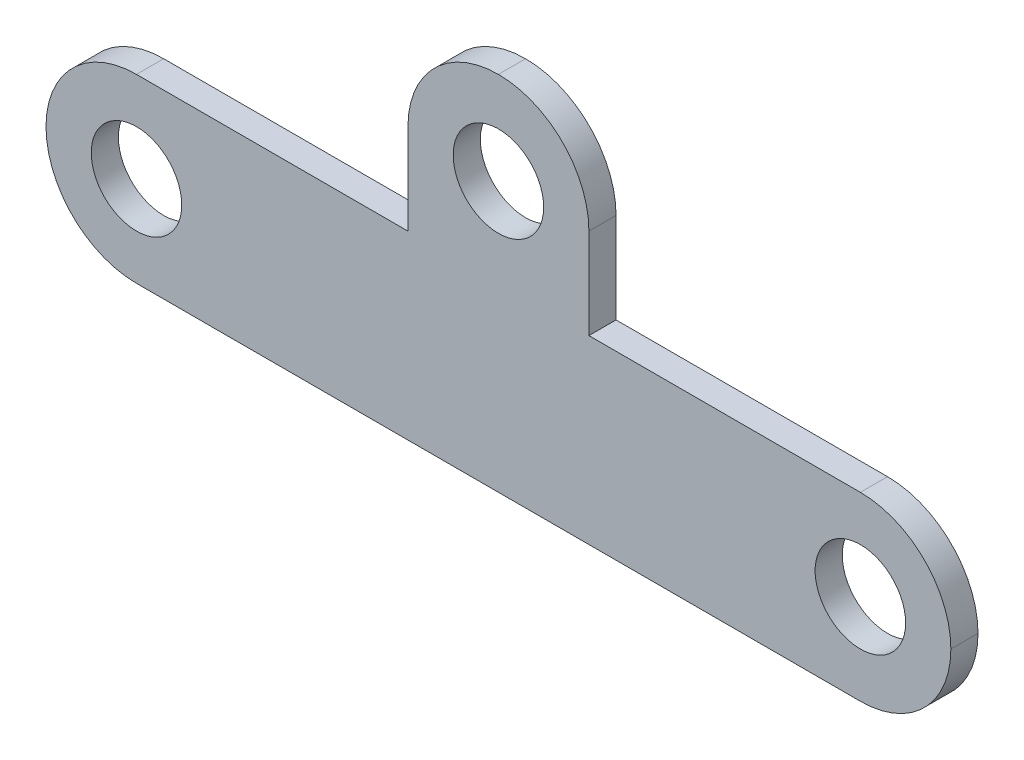
ISO-10303-21;
HEADER;
FILE_DESCRIPTION(('STEP AP214'),'2;1');
FILE_NAME('part.step','',(''),(''),'','','');
FILE_SCHEMA(('AUTOMOTIVE_DESIGN { 1 0 10303 214 1 1 1 1 }'));
ENDSEC;
DATA;
#1=APPLICATION_CONTEXT('core data for automotive mechanical design processes');
#2=APPLICATION_PROTOCOL_DEFINITION('international standard','automotive_design',2000,#1);
#3=PRODUCT_CONTEXT('',#1,'mechanical');
#4=PRODUCT('Part','Part','',(#3));
#5=PRODUCT_RELATED_PRODUCT_CATEGORY('part','',(#4));
#6=PRODUCT_DEFINITION_FORMATION('','',#4);
#7=PRODUCT_DEFINITION_CONTEXT('part definition',#1,'design');
#8=PRODUCT_DEFINITION('design','',#6,#7);
#9=PRODUCT_DEFINITION_SHAPE('','',#8);
#10=(LENGTH_UNIT() NAMED_UNIT(*) SI_UNIT(.MILLI.,.METRE.));
#11=(NAMED_UNIT(*) PLANE_ANGLE_UNIT() SI_UNIT($,.RADIAN.));
#12=(NAMED_UNIT(*) SI_UNIT($,.STERADIAN.) SOLID_ANGLE_UNIT());
#13=UNCERTAINTY_MEASURE_WITH_UNIT(LENGTH_MEASURE(1.E-05),#10,'distance_accuracy_value','');
#14=(GEOMETRIC_REPRESENTATION_CONTEXT(3) GLOBAL_UNCERTAINTY_ASSIGNED_CONTEXT((#13)) GLOBAL_UNIT_ASSIGNED_CONTEXT((#10,
#11,#12)) REPRESENTATION_CONTEXT('',''));
#15=CARTESIAN_POINT('',(0.,0.,0.));
#16=DIRECTION('',(0.,0.,1.));
#17=DIRECTION('',(1.,0.,0.));
#18=AXIS2_PLACEMENT_3D('',#15,#16,#17);
#19=CARTESIAN_POINT('',(0.,20.,3.));
#20=DIRECTION('',(0.,-1.,0.));
#21=DIRECTION('',(0.,0.,-1.));
#22=AXIS2_PLACEMENT_3D('',#19,#20,#21);
#23=PLANE('',#22);
#24=DIRECTION('',(0.,0.,1.));
#25=VECTOR('',#24,1.);
#26=CARTESIAN_POINT('',(40.,20.,3.));
#27=LINE('',#26,#25);
#28=CARTESIAN_POINT('',(40.,20.,0.));
#29=VERTEX_POINT('',#28);
#30=CARTESIAN_POINT('',(40.,20.,3.));
#31=VERTEX_POINT('',#30);
#32=EDGE_CURVE('E119',#29,#31,#27,.T.);
#33=ORIENTED_EDGE('',*,*,#32,.F.);
#34=DIRECTION('',(-1.,0.,0.));
#35=VECTOR('',#34,1.);
#36=CARTESIAN_POINT('',(0.,20.,0.));
#37=LINE('',#36,#35);
#38=CARTESIAN_POINT('',(10.,20.,0.));
#39=VERTEX_POINT('',#38);
#40=EDGE_CURVE('E126',#29,#39,#37,.T.);
#41=ORIENTED_EDGE('',*,*,#40,.T.);
#42=DIRECTION('',(0.,0.,-1.));
#43=VECTOR('',#42,1.);
#44=CARTESIAN_POINT('',(10.,20.,3.));
#45=LINE('',#44,#43);
#46=CARTESIAN_POINT('',(10.,20.,3.));
#47=VERTEX_POINT('',#46);
#48=EDGE_CURVE('E186',#39,#47,#45,.F.);
#49=ORIENTED_EDGE('',*,*,#48,.T.);
#50=DIRECTION('',(-1.,0.,0.));
#51=VECTOR('',#50,1.);
#52=CARTESIAN_POINT('',(0.,20.,3.));
#53=LINE('',#52,#51);
#54=EDGE_CURVE('E137',#31,#47,#53,.T.);
#55=ORIENTED_EDGE('',*,*,#54,.F.);
#56=EDGE_LOOP('',(#33,#41,#49,#55));
#57=FACE_BOUND('',#56,.T.);
#58=ADVANCED_FACE('F33',(#57),#23,.F.);
#59=DIRECTION('',(0.,0.,-1.));
#60=VECTOR('',#59,1.);
#61=CARTESIAN_POINT('',(60.,20.,3.));
#62=LINE('',#61,#60);
#63=CARTESIAN_POINT('',(60.,20.,3.));
#64=VERTEX_POINT('',#63);
#65=CARTESIAN_POINT('',(60.,20.,0.));
#66=VERTEX_POINT('',#65);
#67=EDGE_CURVE('E123',#64,#66,#62,.T.);
#68=ORIENTED_EDGE('',*,*,#67,.F.);
#69=CARTESIAN_POINT('',(90.,20.,3.));
#70=VERTEX_POINT('',#69);
#71=EDGE_CURVE('E158',#70,#64,#53,.T.);
#72=ORIENTED_EDGE('',*,*,#71,.F.);
#73=DIRECTION('',(0.,0.,-1.));
#74=VECTOR('',#73,1.);
#75=CARTESIAN_POINT('',(90.,20.,3.));
#76=LINE('',#75,#74);
#77=CARTESIAN_POINT('',(90.,20.,0.));
#78=VERTEX_POINT('',#77);
#79=EDGE_CURVE('E188',#70,#78,#76,.T.);
#80=ORIENTED_EDGE('',*,*,#79,.T.);
#81=EDGE_CURVE('E133',#78,#66,#37,.T.);
#82=ORIENTED_EDGE('',*,*,#81,.T.);
#83=EDGE_LOOP('',(#68,#72,#80,#82));
#84=FACE_BOUND('',#83,.T.);
#85=ADVANCED_FACE('F247',(#84),#23,.F.);
#86=CARTESIAN_POINT('',(0.,0.,3.));
#87=DIRECTION('',(0.,1.,0.));
#88=DIRECTION('',(0.,0.,1.));
#89=AXIS2_PLACEMENT_3D('',#86,#87,#88);
#90=PLANE('',#89);
#91=DIRECTION('',(1.,0.,0.));
#92=VECTOR('',#91,1.);
#93=CARTESIAN_POINT('',(0.,0.,0.));
#94=LINE('',#93,#92);
#95=CARTESIAN_POINT('',(10.,0.,0.));
#96=VERTEX_POINT('',#95);
#97=CARTESIAN_POINT('',(90.,0.,0.));
#98=VERTEX_POINT('',#97);
#99=EDGE_CURVE('E134',#96,#98,#94,.T.);
#100=ORIENTED_EDGE('',*,*,#99,.T.);
#101=DIRECTION('',(0.,0.,-1.));
#102=VECTOR('',#101,1.);
#103=CARTESIAN_POINT('',(90.,0.,3.));
#104=LINE('',#103,#102);
#105=CARTESIAN_POINT('',(90.,0.,3.));
#106=VERTEX_POINT('',#105);
#107=EDGE_CURVE('E175',#98,#106,#104,.F.);
#108=ORIENTED_EDGE('',*,*,#107,.T.);
#109=DIRECTION('',(1.,0.,0.));
#110=VECTOR('',#109,1.);
#111=CARTESIAN_POINT('',(0.,0.,3.));
#112=LINE('',#111,#110);
#113=CARTESIAN_POINT('',(10.,0.,3.));
#114=VERTEX_POINT('',#113);
#115=EDGE_CURVE('E155',#114,#106,#112,.T.);
#116=ORIENTED_EDGE('',*,*,#115,.F.);
#117=DIRECTION('',(0.,0.,-1.));
#118=VECTOR('',#117,1.);
#119=CARTESIAN_POINT('',(10.,0.,3.));
#120=LINE('',#119,#118);
#121=EDGE_CURVE('E172',#114,#96,#120,.T.);
#122=ORIENTED_EDGE('',*,*,#121,.T.);
#123=EDGE_LOOP('',(#100,#108,#116,#122));
#124=FACE_BOUND('',#123,.T.);
#125=ADVANCED_FACE('F222',(#124),#90,.F.);
#126=CARTESIAN_POINT('',(0.,0.,3.));
#127=DIRECTION('',(0.,0.,-1.));
#128=DIRECTION('',(-1.,0.,0.));
#129=AXIS2_PLACEMENT_3D('',#126,#127,#128);
#130=PLANE('',#129);
#131=CARTESIAN_POINT('',(90.,10.,3.));
#132=DIRECTION('',(0.,0.,1.));
#133=DIRECTION('',(1.,0.,0.));
#134=AXIS2_PLACEMENT_3D('',#131,#132,#133);
#135=CIRCLE('',#134,5.);
#136=CARTESIAN_POINT('',(95.,10.,3.));
#137=VERTEX_POINT('',#136);
#138=EDGE_CURVE('E212',#137,#137,#135,.T.);
#139=ORIENTED_EDGE('',*,*,#138,.F.);
#140=EDGE_LOOP('',(#139));
#141=FACE_BOUND('',#140,.T.);
#142=CARTESIAN_POINT('',(50.,29.7843944745111,3.));
#143=DIRECTION('',(0.,0.,1.));
#144=DIRECTION('',(1.,0.,0.));
#145=AXIS2_PLACEMENT_3D('',#142,#143,#144);
#146=CIRCLE('',#145,5.);
#147=CARTESIAN_POINT('',(55.,29.7843944745111,3.));
#148=VERTEX_POINT('',#147);
#149=EDGE_CURVE('E204',#148,#148,#146,.T.);
#150=ORIENTED_EDGE('',*,*,#149,.F.);
#151=EDGE_LOOP('',(#150));
#152=FACE_BOUND('',#151,.T.);
#153=CARTESIAN_POINT('',(10.,10.,3.));
#154=DIRECTION('',(0.,0.,1.));
#155=DIRECTION('',(1.,0.,0.));
#156=AXIS2_PLACEMENT_3D('',#153,#154,#155);
#157=CIRCLE('',#156,5.);
#158=CARTESIAN_POINT('',(15.,10.,3.));
#159=VERTEX_POINT('',#158);
#160=EDGE_CURVE('E146',#159,#159,#157,.T.);
#161=ORIENTED_EDGE('',*,*,#160,.F.);
#162=EDGE_LOOP('',(#161));
#163=FACE_BOUND('',#162,.T.);
#164=CARTESIAN_POINT('',(50.,30.,3.));
#165=DIRECTION('',(0.,0.,-1.));
#166=DIRECTION('',(-1.,0.,0.));
#167=AXIS2_PLACEMENT_3D('',#164,#165,#166);
#168=CIRCLE('',#167,10.);
#169=CARTESIAN_POINT('',(60.,30.,3.));
#170=VERTEX_POINT('',#169);
#171=CARTESIAN_POINT('',(50.,40.,3.));
#172=VERTEX_POINT('',#171);
#173=EDGE_CURVE('E190',#170,#172,#168,.F.);
#174=ORIENTED_EDGE('',*,*,#173,.T.);
#175=CARTESIAN_POINT('',(50.,30.,3.));
#176=DIRECTION('',(0.,0.,-1.));
#177=DIRECTION('',(-1.,0.,0.));
#178=AXIS2_PLACEMENT_3D('',#175,#176,#177);
#179=CIRCLE('',#178,10.);
#180=CARTESIAN_POINT('',(40.,30.,3.));
#181=VERTEX_POINT('',#180);
#182=EDGE_CURVE('E196',#172,#181,#179,.F.);
#183=ORIENTED_EDGE('',*,*,#182,.T.);
#184=DIRECTION('',(0.,-1.,0.));
#185=VECTOR('',#184,1.);
#186=CARTESIAN_POINT('',(40.,40.,3.));
#187=LINE('',#186,#185);
#188=EDGE_CURVE('E152',#181,#31,#187,.T.);
#189=ORIENTED_EDGE('',*,*,#188,.T.);
#190=ORIENTED_EDGE('',*,*,#54,.T.);
#191=CARTESIAN_POINT('',(10.,10.,3.));
#192=DIRECTION('',(0.,0.,-1.));
#193=DIRECTION('',(-1.,0.,0.));
#194=AXIS2_PLACEMENT_3D('',#191,#192,#193);
#195=CIRCLE('',#194,10.);
#196=CARTESIAN_POINT('',(0.,10.,3.));
#197=VERTEX_POINT('',#196);
#198=EDGE_CURVE('E178',#47,#197,#195,.F.);
#199=ORIENTED_EDGE('',*,*,#198,.T.);
#200=CARTESIAN_POINT('',(10.,10.,3.));
#201=DIRECTION('',(0.,0.,-1.));
#202=DIRECTION('',(-1.,0.,0.));
#203=AXIS2_PLACEMENT_3D('',#200,#201,#202);
#204=CIRCLE('',#203,10.);
#205=EDGE_CURVE('E180',#197,#114,#204,.F.);
#206=ORIENTED_EDGE('',*,*,#205,.T.);
#207=ORIENTED_EDGE('',*,*,#115,.T.);
#208=CARTESIAN_POINT('',(90.,10.,3.));
#209=DIRECTION('',(0.,0.,-1.));
#210=DIRECTION('',(-1.,0.,0.));
#211=AXIS2_PLACEMENT_3D('',#208,#209,#210);
#212=CIRCLE('',#211,10.);
#213=CARTESIAN_POINT('',(100.,10.,3.));
#214=VERTEX_POINT('',#213);
#215=EDGE_CURVE('E184',#106,#214,#212,.F.);
#216=ORIENTED_EDGE('',*,*,#215,.T.);
#217=CARTESIAN_POINT('',(90.,10.,3.));
#218=DIRECTION('',(0.,0.,-1.));
#219=DIRECTION('',(-1.,0.,0.));
#220=AXIS2_PLACEMENT_3D('',#217,#218,#219);
#221=CIRCLE('',#220,10.);
#222=EDGE_CURVE('E182',#214,#70,#221,.F.);
#223=ORIENTED_EDGE('',*,*,#222,.T.);
#224=ORIENTED_EDGE('',*,*,#71,.T.);
#225=DIRECTION('',(0.,-1.,0.));
#226=VECTOR('',#225,1.);
#227=CARTESIAN_POINT('',(60.,40.,3.));
#228=LINE('',#227,#226);
#229=EDGE_CURVE('E150',#170,#64,#228,.T.);
#230=ORIENTED_EDGE('',*,*,#229,.F.);
#231=EDGE_LOOP('',(#174,#183,#189,#190,#199,#206,#207,#216,#223,#224,#230));
#232=FACE_BOUND('',#231,.T.);
#233=ADVANCED_FACE('F219',(#141,#152,#163,#232),#130,.F.);
#234=CARTESIAN_POINT('',(0.,0.,0.));
#235=DIRECTION('',(0.,0.,-1.));
#236=DIRECTION('',(-1.,0.,0.));
#237=AXIS2_PLACEMENT_3D('',#234,#235,#236);
#238=PLANE('',#237);
#239=CARTESIAN_POINT('',(90.,10.,0.));
#240=DIRECTION('',(0.,0.,-1.));
#241=DIRECTION('',(-1.,0.,0.));
#242=AXIS2_PLACEMENT_3D('',#239,#240,#241);
#243=CIRCLE('',#242,5.);
#244=CARTESIAN_POINT('',(85.,10.,0.));
#245=VERTEX_POINT('',#244);
#246=EDGE_CURVE('E37',#245,#245,#243,.T.);
#247=ORIENTED_EDGE('',*,*,#246,.F.);
#248=EDGE_LOOP('',(#247));
#249=FACE_BOUND('',#248,.T.);
#250=CARTESIAN_POINT('',(50.,29.7843944745111,0.));
#251=DIRECTION('',(0.,0.,-1.));
#252=DIRECTION('',(-1.,0.,0.));
#253=AXIS2_PLACEMENT_3D('',#250,#251,#252);
#254=CIRCLE('',#253,5.);
#255=CARTESIAN_POINT('',(45.,29.7843944745111,0.));
#256=VERTEX_POINT('',#255);
#257=EDGE_CURVE('E202',#256,#256,#254,.T.);
#258=ORIENTED_EDGE('',*,*,#257,.F.);
#259=EDGE_LOOP('',(#258));
#260=FACE_BOUND('',#259,.T.);
#261=CARTESIAN_POINT('',(10.,10.,0.));
#262=DIRECTION('',(0.,0.,-1.));
#263=DIRECTION('',(-1.,0.,0.));
#264=AXIS2_PLACEMENT_3D('',#261,#262,#263);
#265=CIRCLE('',#264,5.);
#266=CARTESIAN_POINT('',(5.,10.,0.));
#267=VERTEX_POINT('',#266);
#268=EDGE_CURVE('E143',#267,#267,#265,.T.);
#269=ORIENTED_EDGE('',*,*,#268,.F.);
#270=EDGE_LOOP('',(#269));
#271=FACE_BOUND('',#270,.T.);
#272=DIRECTION('',(0.,-1.,0.));
#273=VECTOR('',#272,1.);
#274=CARTESIAN_POINT('',(40.,40.,0.));
#275=LINE('',#274,#273);
#276=CARTESIAN_POINT('',(40.,30.,0.));
#277=VERTEX_POINT('',#276);
#278=EDGE_CURVE('E114',#277,#29,#275,.T.);
#279=ORIENTED_EDGE('',*,*,#278,.F.);
#280=CARTESIAN_POINT('',(50.,30.,0.));
#281=DIRECTION('',(0.,0.,-1.));
#282=DIRECTION('',(-1.,0.,0.));
#283=AXIS2_PLACEMENT_3D('',#280,#281,#282);
#284=CIRCLE('',#283,10.);
#285=CARTESIAN_POINT('',(50.,40.,0.));
#286=VERTEX_POINT('',#285);
#287=EDGE_CURVE('E42',#277,#286,#284,.T.);
#288=ORIENTED_EDGE('',*,*,#287,.T.);
#289=CARTESIAN_POINT('',(50.,30.,0.));
#290=DIRECTION('',(0.,0.,-1.));
#291=DIRECTION('',(-1.,0.,0.));
#292=AXIS2_PLACEMENT_3D('',#289,#290,#291);
#293=CIRCLE('',#292,10.);
#294=CARTESIAN_POINT('',(60.,30.,0.));
#295=VERTEX_POINT('',#294);
#296=EDGE_CURVE('E50',#286,#295,#293,.T.);
#297=ORIENTED_EDGE('',*,*,#296,.T.);
#298=DIRECTION('',(0.,-1.,0.));
#299=VECTOR('',#298,1.);
#300=CARTESIAN_POINT('',(60.,40.,0.));
#301=LINE('',#300,#299);
#302=EDGE_CURVE('E122',#295,#66,#301,.T.);
#303=ORIENTED_EDGE('',*,*,#302,.T.);
#304=ORIENTED_EDGE('',*,*,#81,.F.);
#305=CARTESIAN_POINT('',(90.,10.,0.));
#306=DIRECTION('',(0.,0.,-1.));
#307=DIRECTION('',(-1.,0.,0.));
#308=AXIS2_PLACEMENT_3D('',#305,#306,#307);
#309=CIRCLE('',#308,10.);
#310=CARTESIAN_POINT('',(100.,10.,0.));
#311=VERTEX_POINT('',#310);
#312=EDGE_CURVE('E168',#78,#311,#309,.T.);
#313=ORIENTED_EDGE('',*,*,#312,.T.);
#314=CARTESIAN_POINT('',(90.,10.,0.));
#315=DIRECTION('',(0.,0.,-1.));
#316=DIRECTION('',(-1.,0.,0.));
#317=AXIS2_PLACEMENT_3D('',#314,#315,#316);
#318=CIRCLE('',#317,10.);
#319=EDGE_CURVE('E170',#311,#98,#318,.T.);
#320=ORIENTED_EDGE('',*,*,#319,.T.);
#321=ORIENTED_EDGE('',*,*,#99,.F.);
#322=CARTESIAN_POINT('',(10.,10.,0.));
#323=DIRECTION('',(0.,0.,-1.));
#324=DIRECTION('',(-1.,0.,0.));
#325=AXIS2_PLACEMENT_3D('',#322,#323,#324);
#326=CIRCLE('',#325,10.);
#327=CARTESIAN_POINT('',(0.,10.,0.));
#328=VERTEX_POINT('',#327);
#329=EDGE_CURVE('E166',#96,#328,#326,.T.);
#330=ORIENTED_EDGE('',*,*,#329,.T.);
#331=CARTESIAN_POINT('',(10.,10.,0.));
#332=DIRECTION('',(0.,0.,-1.));
#333=DIRECTION('',(-1.,0.,0.));
#334=AXIS2_PLACEMENT_3D('',#331,#332,#333);
#335=CIRCLE('',#334,10.);
#336=EDGE_CURVE('E129',#328,#39,#335,.T.);
#337=ORIENTED_EDGE('',*,*,#336,.T.);
#338=ORIENTED_EDGE('',*,*,#40,.F.);
#339=EDGE_LOOP('',(#279,#288,#297,#303,#304,#313,#320,#321,#330,#337,#338));
#340=FACE_BOUND('',#339,.T.);
#341=ADVANCED_FACE('F127',(#249,#260,#271,#340),#238,.T.);
#342=CARTESIAN_POINT('',(90.,10.,3.));
#343=DIRECTION('',(0.,0.,-1.));
#344=DIRECTION('',(-1.,0.,0.));
#345=AXIS2_PLACEMENT_3D('',#342,#343,#344);
#346=CYLINDRICAL_SURFACE('',#345,10.);
#347=ORIENTED_EDGE('',*,*,#79,.F.);
#348=ORIENTED_EDGE('',*,*,#222,.F.);
#349=DIRECTION('',(0.,0.,-1.));
#350=VECTOR('',#349,1.);
#351=CARTESIAN_POINT('',(100.,10.,3.));
#352=LINE('',#351,#350);
#353=EDGE_CURVE('E162',#311,#214,#352,.F.);
#354=ORIENTED_EDGE('',*,*,#353,.F.);
#355=ORIENTED_EDGE('',*,*,#312,.F.);
#356=EDGE_LOOP('',(#347,#348,#354,#355));
#357=FACE_BOUND('',#356,.T.);
#358=ADVANCED_FACE('F262',(#357),#346,.T.);
#359=CARTESIAN_POINT('',(90.,10.,3.));
#360=DIRECTION('',(0.,0.,-1.));
#361=DIRECTION('',(-1.,0.,0.));
#362=AXIS2_PLACEMENT_3D('',#359,#360,#361);
#363=CYLINDRICAL_SURFACE('',#362,10.);
#364=ORIENTED_EDGE('',*,*,#215,.F.);
#365=ORIENTED_EDGE('',*,*,#107,.F.);
#366=ORIENTED_EDGE('',*,*,#319,.F.);
#367=ORIENTED_EDGE('',*,*,#353,.T.);
#368=EDGE_LOOP('',(#364,#365,#366,#367));
#369=FACE_BOUND('',#368,.T.);
#370=ADVANCED_FACE('F258',(#369),#363,.T.);
#371=CARTESIAN_POINT('',(10.,10.,3.));
#372=DIRECTION('',(0.,0.,-1.));
#373=DIRECTION('',(-1.,0.,0.));
#374=AXIS2_PLACEMENT_3D('',#371,#372,#373);
#375=CYLINDRICAL_SURFACE('',#374,10.);
#376=DIRECTION('',(0.,0.,-1.));
#377=VECTOR('',#376,1.);
#378=CARTESIAN_POINT('',(0.,10.,3.));
#379=LINE('',#378,#377);
#380=EDGE_CURVE('E154',#197,#328,#379,.T.);
#381=ORIENTED_EDGE('',*,*,#380,.F.);
#382=ORIENTED_EDGE('',*,*,#198,.F.);
#383=ORIENTED_EDGE('',*,*,#48,.F.);
#384=ORIENTED_EDGE('',*,*,#336,.F.);
#385=EDGE_LOOP('',(#381,#382,#383,#384));
#386=FACE_BOUND('',#385,.T.);
#387=ADVANCED_FACE('F261',(#386),#375,.T.);
#388=CARTESIAN_POINT('',(10.,10.,3.));
#389=DIRECTION('',(0.,0.,-1.));
#390=DIRECTION('',(-1.,0.,0.));
#391=AXIS2_PLACEMENT_3D('',#388,#389,#390);
#392=CYLINDRICAL_SURFACE('',#391,10.);
#393=ORIENTED_EDGE('',*,*,#205,.F.);
#394=ORIENTED_EDGE('',*,*,#380,.T.);
#395=ORIENTED_EDGE('',*,*,#329,.F.);
#396=ORIENTED_EDGE('',*,*,#121,.F.);
#397=EDGE_LOOP('',(#393,#394,#395,#396));
#398=FACE_BOUND('',#397,.T.);
#399=ADVANCED_FACE('F267',(#398),#392,.T.);
#400=CARTESIAN_POINT('',(40.,40.,3.));
#401=DIRECTION('',(1.,0.,0.));
#402=DIRECTION('',(0.,0.,-1.));
#403=AXIS2_PLACEMENT_3D('',#400,#401,#402);
#404=PLANE('',#403);
#405=ORIENTED_EDGE('',*,*,#188,.F.);
#406=DIRECTION('',(0.,0.,1.));
#407=VECTOR('',#406,1.);
#408=CARTESIAN_POINT('',(40.,30.,3.));
#409=LINE('',#408,#407);
#410=EDGE_CURVE('E121',#181,#277,#409,.F.);
#411=ORIENTED_EDGE('',*,*,#410,.T.);
#412=ORIENTED_EDGE('',*,*,#278,.T.);
#413=ORIENTED_EDGE('',*,*,#32,.T.);
#414=EDGE_LOOP('',(#405,#411,#412,#413));
#415=FACE_BOUND('',#414,.T.);
#416=ADVANCED_FACE('F117',(#415),#404,.F.);
#417=CARTESIAN_POINT('',(60.,40.,3.));
#418=DIRECTION('',(-1.,0.,0.));
#419=DIRECTION('',(0.,0.,1.));
#420=AXIS2_PLACEMENT_3D('',#417,#418,#419);
#421=PLANE('',#420);
#422=ORIENTED_EDGE('',*,*,#302,.F.);
#423=DIRECTION('',(0.,0.,-1.));
#424=VECTOR('',#423,1.);
#425=CARTESIAN_POINT('',(60.,30.,3.));
#426=LINE('',#425,#424);
#427=EDGE_CURVE('E11',#295,#170,#426,.F.);
#428=ORIENTED_EDGE('',*,*,#427,.T.);
#429=ORIENTED_EDGE('',*,*,#229,.T.);
#430=ORIENTED_EDGE('',*,*,#67,.T.);
#431=EDGE_LOOP('',(#422,#428,#429,#430));
#432=FACE_BOUND('',#431,.T.);
#433=ADVANCED_FACE('F244',(#432),#421,.F.);
#434=CARTESIAN_POINT('',(50.,30.,0.));
#435=DIRECTION('',(0.,0.,-1.));
#436=DIRECTION('',(-1.,0.,0.));
#437=AXIS2_PLACEMENT_3D('',#434,#435,#436);
#438=CYLINDRICAL_SURFACE('',#437,10.);
#439=ORIENTED_EDGE('',*,*,#427,.F.);
#440=ORIENTED_EDGE('',*,*,#296,.F.);
#441=DIRECTION('',(0.,0.,-1.));
#442=VECTOR('',#441,1.);
#443=CARTESIAN_POINT('',(50.,40.,0.));
#444=LINE('',#443,#442);
#445=EDGE_CURVE('E138',#172,#286,#444,.T.);
#446=ORIENTED_EDGE('',*,*,#445,.F.);
#447=ORIENTED_EDGE('',*,*,#173,.F.);
#448=EDGE_LOOP('',(#439,#440,#446,#447));
#449=FACE_BOUND('',#448,.T.);
#450=ADVANCED_FACE('F35',(#449),#438,.T.);
#451=CARTESIAN_POINT('',(50.,30.,0.));
#452=DIRECTION('',(0.,0.,1.));
#453=DIRECTION('',(1.,0.,0.));
#454=AXIS2_PLACEMENT_3D('',#451,#452,#453);
#455=CYLINDRICAL_SURFACE('',#454,10.);
#456=ORIENTED_EDGE('',*,*,#287,.F.);
#457=ORIENTED_EDGE('',*,*,#410,.F.);
#458=ORIENTED_EDGE('',*,*,#182,.F.);
#459=ORIENTED_EDGE('',*,*,#445,.T.);
#460=EDGE_LOOP('',(#456,#457,#458,#459));
#461=FACE_BOUND('',#460,.T.);
#462=ADVANCED_FACE('F234',(#461),#455,.T.);
#463=CARTESIAN_POINT('',(10.,10.,-7.));
#464=DIRECTION('',(0.,0.,1.));
#465=DIRECTION('',(1.,0.,0.));
#466=AXIS2_PLACEMENT_3D('',#463,#464,#465);
#467=CYLINDRICAL_SURFACE('',#466,5.);
#468=ORIENTED_EDGE('',*,*,#268,.T.);
#469=EDGE_LOOP('',(#468));
#470=FACE_BOUND('',#469,.T.);
#471=ORIENTED_EDGE('',*,*,#160,.T.);
#472=EDGE_LOOP('',(#471));
#473=FACE_BOUND('',#472,.T.);
#474=ADVANCED_FACE('F236',(#470,#473),#467,.F.);
#475=CARTESIAN_POINT('',(50.,29.7843944745111,-7.));
#476=DIRECTION('',(0.,0.,1.));
#477=DIRECTION('',(1.,0.,0.));
#478=AXIS2_PLACEMENT_3D('',#475,#476,#477);
#479=CYLINDRICAL_SURFACE('',#478,5.);
#480=ORIENTED_EDGE('',*,*,#257,.T.);
#481=EDGE_LOOP('',(#480));
#482=FACE_BOUND('',#481,.T.);
#483=ORIENTED_EDGE('',*,*,#149,.T.);
#484=EDGE_LOOP('',(#483));
#485=FACE_BOUND('',#484,.T.);
#486=ADVANCED_FACE('F241',(#482,#485),#479,.F.);
#487=CARTESIAN_POINT('',(90.,10.,-7.));
#488=DIRECTION('',(0.,0.,1.));
#489=DIRECTION('',(1.,0.,0.));
#490=AXIS2_PLACEMENT_3D('',#487,#488,#489);
#491=CYLINDRICAL_SURFACE('',#490,5.);
#492=ORIENTED_EDGE('',*,*,#246,.T.);
#493=EDGE_LOOP('',(#492));
#494=FACE_BOUND('',#493,.T.);
#495=ORIENTED_EDGE('',*,*,#138,.T.);
#496=EDGE_LOOP('',(#495));
#497=FACE_BOUND('',#496,.T.);
#498=ADVANCED_FACE('F217',(#494,#497),#491,.F.);
#499=CLOSED_SHELL('',(#58,#85,#125,#233,#341,#358,#370,#387,#399,#416,#433,#450,#462,#474,#486,#498));
#500=MANIFOLD_SOLID_BREP('B2',#499);
#501=ADVANCED_BREP_SHAPE_REPRESENTATION('',(#18,#500),#14);
#502=SHAPE_DEFINITION_REPRESENTATION(#9,#501);
ENDSEC;
END-ISO-10303-21;
